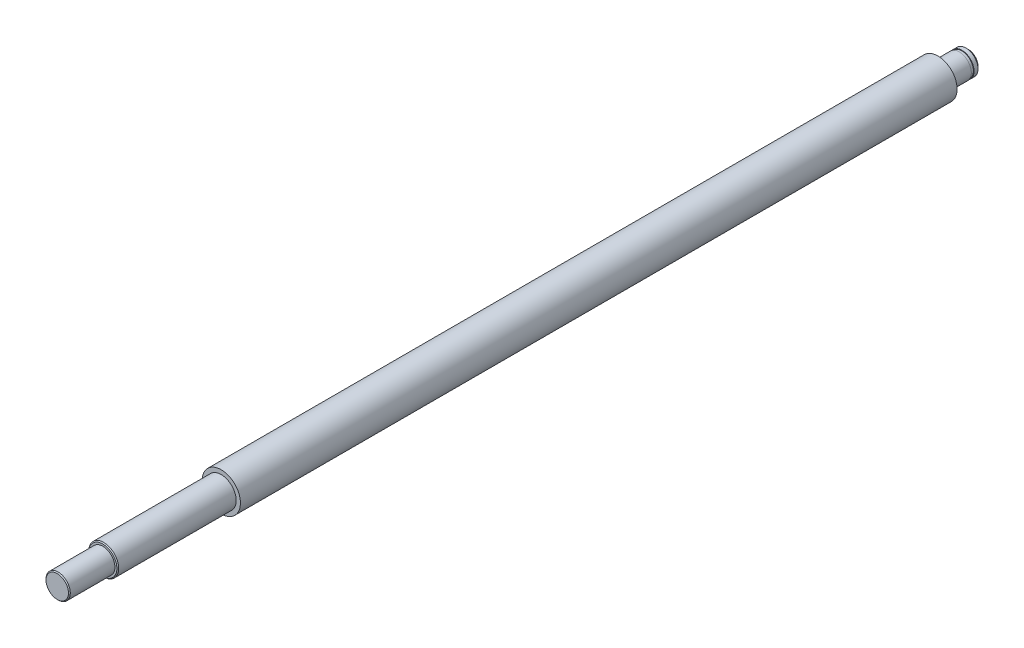
ISO-10303-21;
HEADER;
FILE_DESCRIPTION(('STEP AP214'),'2;1');
FILE_NAME('part.step','',(''),(''),'','','');
FILE_SCHEMA(('AUTOMOTIVE_DESIGN { 1 0 10303 214 1 1 1 1 }'));
ENDSEC;
DATA;
#1=APPLICATION_CONTEXT('core data for automotive mechanical design processes');
#2=APPLICATION_PROTOCOL_DEFINITION('international standard','automotive_design',2000,#1);
#3=PRODUCT_CONTEXT('',#1,'mechanical');
#4=PRODUCT('Part','Part','',(#3));
#5=PRODUCT_RELATED_PRODUCT_CATEGORY('part','',(#4));
#6=PRODUCT_DEFINITION_FORMATION('','',#4);
#7=PRODUCT_DEFINITION_CONTEXT('part definition',#1,'design');
#8=PRODUCT_DEFINITION('design','',#6,#7);
#9=PRODUCT_DEFINITION_SHAPE('','',#8);
#10=(LENGTH_UNIT() NAMED_UNIT(*) SI_UNIT(.MILLI.,.METRE.));
#11=(NAMED_UNIT(*) PLANE_ANGLE_UNIT() SI_UNIT($,.RADIAN.));
#12=(NAMED_UNIT(*) SI_UNIT($,.STERADIAN.) SOLID_ANGLE_UNIT());
#13=UNCERTAINTY_MEASURE_WITH_UNIT(LENGTH_MEASURE(1.E-05),#10,'distance_accuracy_value','');
#14=(GEOMETRIC_REPRESENTATION_CONTEXT(3) GLOBAL_UNCERTAINTY_ASSIGNED_CONTEXT((#13)) GLOBAL_UNIT_ASSIGNED_CONTEXT((#10,
#11,#12)) REPRESENTATION_CONTEXT('',''));
#15=CARTESIAN_POINT('',(0.,0.,0.));
#16=DIRECTION('',(0.,0.,1.));
#17=DIRECTION('',(1.,0.,0.));
#18=AXIS2_PLACEMENT_3D('',#15,#16,#17);
#19=CARTESIAN_POINT('',(0.,0.,150.));
#20=DIRECTION('',(0.,0.,-1.));
#21=DIRECTION('',(-1.,0.,0.));
#22=AXIS2_PLACEMENT_3D('',#19,#20,#21);
#23=PLANE('',#22);
#24=CARTESIAN_POINT('',(0.,0.,150.));
#25=DIRECTION('',(0.,0.,-1.));
#26=DIRECTION('',(-1.,0.,0.));
#27=AXIS2_PLACEMENT_3D('',#24,#25,#26);
#28=CIRCLE('',#27,3.69999999999998);
#29=CARTESIAN_POINT('',(-3.69999999999998,0.,150.));
#30=VERTEX_POINT('',#29);
#31=EDGE_CURVE('E48',#30,#30,#28,.F.);
#32=ORIENTED_EDGE('',*,*,#31,.T.);
#33=EDGE_LOOP('',(#32));
#34=FACE_BOUND('',#33,.T.);
#35=ADVANCED_FACE('F33',(#34),#23,.F.);
#36=CARTESIAN_POINT('',(0.,0.,150.));
#37=DIRECTION('',(0.,0.,1.));
#38=DIRECTION('',(1.,0.,0.));
#39=AXIS2_PLACEMENT_3D('',#36,#37,#38);
#40=CYLINDRICAL_SURFACE('',#39,4.);
#41=CARTESIAN_POINT('',(0.,0.,149.7));
#42=DIRECTION('',(0.,0.,-1.));
#43=DIRECTION('',(-1.,0.,0.));
#44=AXIS2_PLACEMENT_3D('',#41,#42,#43);
#45=CIRCLE('',#44,4.);
#46=CARTESIAN_POINT('',(-4.,0.,149.7));
#47=VERTEX_POINT('',#46);
#48=EDGE_CURVE('E44',#47,#47,#45,.T.);
#49=ORIENTED_EDGE('',*,*,#48,.T.);
#50=EDGE_LOOP('',(#49));
#51=FACE_BOUND('',#50,.T.);
#52=CARTESIAN_POINT('',(0.,0.,135.));
#53=DIRECTION('',(0.,0.,1.));
#54=DIRECTION('',(1.,0.,0.));
#55=AXIS2_PLACEMENT_3D('',#52,#53,#54);
#56=CIRCLE('',#55,4.);
#57=CARTESIAN_POINT('',(4.,0.,135.));
#58=VERTEX_POINT('',#57);
#59=EDGE_CURVE('E59',#58,#58,#56,.T.);
#60=ORIENTED_EDGE('',*,*,#59,.T.);
#61=EDGE_LOOP('',(#60));
#62=FACE_BOUND('',#61,.T.);
#63=ADVANCED_FACE('F127',(#51,#62),#40,.T.);
#64=CARTESIAN_POINT('',(0.,4.,135.));
#65=DIRECTION('',(0.,0.,-1.));
#66=DIRECTION('',(-1.,0.,0.));
#67=AXIS2_PLACEMENT_3D('',#64,#65,#66);
#68=PLANE('',#67);
#69=CARTESIAN_POINT('',(0.,0.,135.));
#70=DIRECTION('',(0.,0.,-1.));
#71=DIRECTION('',(-1.,0.,0.));
#72=AXIS2_PLACEMENT_3D('',#69,#70,#71);
#73=CIRCLE('',#72,4.64000000000001);
#74=CARTESIAN_POINT('',(-4.64000000000001,0.,135.));
#75=VERTEX_POINT('',#74);
#76=EDGE_CURVE('E40',#75,#75,#73,.F.);
#77=ORIENTED_EDGE('',*,*,#76,.T.);
#78=EDGE_LOOP('',(#77));
#79=FACE_BOUND('',#78,.T.);
#80=ORIENTED_EDGE('',*,*,#59,.F.);
#81=EDGE_LOOP('',(#80));
#82=FACE_BOUND('',#81,.T.);
#83=ADVANCED_FACE('F133',(#79,#82),#68,.F.);
#84=CARTESIAN_POINT('',(0.,0.,150.));
#85=DIRECTION('',(0.,0.,1.));
#86=DIRECTION('',(1.,0.,0.));
#87=AXIS2_PLACEMENT_3D('',#84,#85,#86);
#88=CYLINDRICAL_SURFACE('',#87,4.94);
#89=CARTESIAN_POINT('',(0.,0.,134.7));
#90=DIRECTION('',(0.,0.,-1.));
#91=DIRECTION('',(-1.,0.,0.));
#92=AXIS2_PLACEMENT_3D('',#89,#90,#91);
#93=CIRCLE('',#92,4.94);
#94=CARTESIAN_POINT('',(-4.94,0.,134.7));
#95=VERTEX_POINT('',#94);
#96=EDGE_CURVE('E10',#95,#95,#93,.T.);
#97=ORIENTED_EDGE('',*,*,#96,.T.);
#98=EDGE_LOOP('',(#97));
#99=FACE_BOUND('',#98,.T.);
#100=CARTESIAN_POINT('',(0.,0.,96.));
#101=DIRECTION('',(0.,0.,1.));
#102=DIRECTION('',(1.,0.,0.));
#103=AXIS2_PLACEMENT_3D('',#100,#101,#102);
#104=CIRCLE('',#103,4.94);
#105=CARTESIAN_POINT('',(4.94,0.,96.));
#106=VERTEX_POINT('',#105);
#107=EDGE_CURVE('E62',#106,#106,#104,.T.);
#108=ORIENTED_EDGE('',*,*,#107,.T.);
#109=EDGE_LOOP('',(#108));
#110=FACE_BOUND('',#109,.T.);
#111=ADVANCED_FACE('F155',(#99,#110),#88,.T.);
#112=CARTESIAN_POINT('',(0.,4.94,96.));
#113=DIRECTION('',(0.,0.,-1.));
#114=DIRECTION('',(-1.,0.,0.));
#115=AXIS2_PLACEMENT_3D('',#112,#113,#114);
#116=PLANE('',#115);
#117=ORIENTED_EDGE('',*,*,#107,.F.);
#118=EDGE_LOOP('',(#117));
#119=FACE_BOUND('',#118,.T.);
#120=CARTESIAN_POINT('',(0.,0.,96.));
#121=DIRECTION('',(0.,0.,1.));
#122=DIRECTION('',(1.,0.,0.));
#123=AXIS2_PLACEMENT_3D('',#120,#121,#122);
#124=CIRCLE('',#123,6.32);
#125=CARTESIAN_POINT('',(6.32,0.,96.));
#126=VERTEX_POINT('',#125);
#127=EDGE_CURVE('E65',#126,#126,#124,.T.);
#128=ORIENTED_EDGE('',*,*,#127,.T.);
#129=EDGE_LOOP('',(#128));
#130=FACE_BOUND('',#129,.T.);
#131=ADVANCED_FACE('F122',(#119,#130),#116,.F.);
#132=CARTESIAN_POINT('',(0.,0.,150.));
#133=DIRECTION('',(0.,0.,1.));
#134=DIRECTION('',(1.,0.,0.));
#135=AXIS2_PLACEMENT_3D('',#132,#133,#134);
#136=CYLINDRICAL_SURFACE('',#135,6.32);
#137=ORIENTED_EDGE('',*,*,#127,.F.);
#138=EDGE_LOOP('',(#137));
#139=FACE_BOUND('',#138,.T.);
#140=CARTESIAN_POINT('',(0.,0.,-140.));
#141=DIRECTION('',(0.,0.,1.));
#142=DIRECTION('',(1.,0.,0.));
#143=AXIS2_PLACEMENT_3D('',#140,#141,#142);
#144=CIRCLE('',#143,6.32);
#145=CARTESIAN_POINT('',(6.32,0.,-140.));
#146=VERTEX_POINT('',#145);
#147=EDGE_CURVE('E68',#146,#146,#144,.T.);
#148=ORIENTED_EDGE('',*,*,#147,.T.);
#149=EDGE_LOOP('',(#148));
#150=FACE_BOUND('',#149,.T.);
#151=ADVANCED_FACE('F116',(#139,#150),#136,.T.);
#152=CARTESIAN_POINT('',(0.,6.32,-140.));
#153=DIRECTION('',(0.,0.,1.));
#154=DIRECTION('',(1.,0.,0.));
#155=AXIS2_PLACEMENT_3D('',#152,#153,#154);
#156=PLANE('',#155);
#157=ORIENTED_EDGE('',*,*,#147,.F.);
#158=EDGE_LOOP('',(#157));
#159=FACE_BOUND('',#158,.T.);
#160=CARTESIAN_POINT('',(0.,0.,-140.));
#161=DIRECTION('',(0.,0.,1.));
#162=DIRECTION('',(1.,0.,0.));
#163=AXIS2_PLACEMENT_3D('',#160,#161,#162);
#164=CIRCLE('',#163,4.);
#165=CARTESIAN_POINT('',(4.,0.,-140.));
#166=VERTEX_POINT('',#165);
#167=EDGE_CURVE('E71',#166,#166,#164,.T.);
#168=ORIENTED_EDGE('',*,*,#167,.T.);
#169=EDGE_LOOP('',(#168));
#170=FACE_BOUND('',#169,.T.);
#171=ADVANCED_FACE('F111',(#159,#170),#156,.F.);
#172=CARTESIAN_POINT('',(0.,0.,150.));
#173=DIRECTION('',(0.,0.,1.));
#174=DIRECTION('',(1.,0.,0.));
#175=AXIS2_PLACEMENT_3D('',#172,#173,#174);
#176=CYLINDRICAL_SURFACE('',#175,4.);
#177=CARTESIAN_POINT('',(0.,0.,-147.));
#178=DIRECTION('',(0.,0.,-1.));
#179=DIRECTION('',(0.,1.,0.));
#180=AXIS2_PLACEMENT_3D('',#177,#178,#179);
#181=CIRCLE('',#180,4.00000000000002);
#182=CARTESIAN_POINT('',(0.,4.,-147.));
#183=VERTEX_POINT('',#182);
#184=EDGE_CURVE('E80',#183,#183,#181,.T.);
#185=ORIENTED_EDGE('',*,*,#184,.F.);
#186=EDGE_LOOP('',(#185));
#187=FACE_BOUND('',#186,.T.);
#188=ORIENTED_EDGE('',*,*,#167,.F.);
#189=EDGE_LOOP('',(#188));
#190=FACE_BOUND('',#189,.T.);
#191=ADVANCED_FACE('F93',(#187,#190),#176,.T.);
#192=CARTESIAN_POINT('',(0.,4.,-147.9));
#193=DIRECTION('',(0.,0.,-1.));
#194=DIRECTION('',(0.,1.,0.));
#195=AXIS2_PLACEMENT_3D('',#192,#193,#194);
#196=PLANE('',#195);
#197=CARTESIAN_POINT('',(0.,0.,-147.9));
#198=DIRECTION('',(0.,0.,-1.));
#199=DIRECTION('',(0.,1.,0.));
#200=AXIS2_PLACEMENT_3D('',#197,#198,#199);
#201=CIRCLE('',#200,4.00000000000001);
#202=CARTESIAN_POINT('',(0.,4.,-147.9));
#203=VERTEX_POINT('',#202);
#204=EDGE_CURVE('E83',#203,#203,#201,.T.);
#205=ORIENTED_EDGE('',*,*,#204,.F.);
#206=EDGE_LOOP('',(#205));
#207=FACE_BOUND('',#206,.T.);
#208=CARTESIAN_POINT('',(0.,0.,-147.9));
#209=DIRECTION('',(0.,0.,-1.));
#210=DIRECTION('',(0.,1.,0.));
#211=AXIS2_PLACEMENT_3D('',#208,#209,#210);
#212=CIRCLE('',#211,3.79999999999996);
#213=CARTESIAN_POINT('',(0.,3.79999999999994,-147.9));
#214=VERTEX_POINT('',#213);
#215=EDGE_CURVE('E74',#214,#214,#212,.T.);
#216=ORIENTED_EDGE('',*,*,#215,.T.);
#217=EDGE_LOOP('',(#216));
#218=FACE_BOUND('',#217,.T.);
#219=ADVANCED_FACE('F89',(#207,#218),#196,.F.);
#220=CARTESIAN_POINT('',(0.,0.,-150.));
#221=DIRECTION('',(0.,0.,-1.));
#222=DIRECTION('',(0.,1.,0.));
#223=AXIS2_PLACEMENT_3D('',#220,#221,#222);
#224=CYLINDRICAL_SURFACE('',#223,3.79999999999996);
#225=ORIENTED_EDGE('',*,*,#215,.F.);
#226=EDGE_LOOP('',(#225));
#227=FACE_BOUND('',#226,.T.);
#228=CARTESIAN_POINT('',(0.,0.,-147.));
#229=DIRECTION('',(0.,0.,-1.));
#230=DIRECTION('',(0.,1.,0.));
#231=AXIS2_PLACEMENT_3D('',#228,#229,#230);
#232=CIRCLE('',#231,3.79999999999996);
#233=CARTESIAN_POINT('',(0.,3.79999999999994,-147.));
#234=VERTEX_POINT('',#233);
#235=EDGE_CURVE('E77',#234,#234,#232,.T.);
#236=ORIENTED_EDGE('',*,*,#235,.T.);
#237=EDGE_LOOP('',(#236));
#238=FACE_BOUND('',#237,.T.);
#239=ADVANCED_FACE('F92',(#227,#238),#224,.T.);
#240=CARTESIAN_POINT('',(0.,4.,-147.));
#241=DIRECTION('',(0.,0.,1.));
#242=DIRECTION('',(0.,-1.,0.));
#243=AXIS2_PLACEMENT_3D('',#240,#241,#242);
#244=PLANE('',#243);
#245=ORIENTED_EDGE('',*,*,#235,.F.);
#246=EDGE_LOOP('',(#245));
#247=FACE_BOUND('',#246,.T.);
#248=ORIENTED_EDGE('',*,*,#184,.T.);
#249=EDGE_LOOP('',(#248));
#250=FACE_BOUND('',#249,.T.);
#251=ADVANCED_FACE('F99',(#247,#250),#244,.F.);
#252=CARTESIAN_POINT('',(0.,4.,-150.));
#253=DIRECTION('',(0.,0.,1.));
#254=DIRECTION('',(1.,0.,0.));
#255=AXIS2_PLACEMENT_3D('',#252,#253,#254);
#256=PLANE('',#255);
#257=CARTESIAN_POINT('',(0.,0.,-150.));
#258=DIRECTION('',(0.,0.,1.));
#259=DIRECTION('',(1.,0.,0.));
#260=AXIS2_PLACEMENT_3D('',#257,#258,#259);
#261=CIRCLE('',#260,3.19999999999998);
#262=CARTESIAN_POINT('',(3.19999999999998,0.,-150.));
#263=VERTEX_POINT('',#262);
#264=EDGE_CURVE('E53',#263,#263,#261,.F.);
#265=ORIENTED_EDGE('',*,*,#264,.T.);
#266=EDGE_LOOP('',(#265));
#267=FACE_BOUND('',#266,.T.);
#268=ADVANCED_FACE('F105',(#267),#256,.F.);
#269=CARTESIAN_POINT('',(0.,0.,-149.2));
#270=DIRECTION('',(0.,0.,1.));
#271=DIRECTION('',(1.,0.,0.));
#272=AXIS2_PLACEMENT_3D('',#269,#270,#271);
#273=CIRCLE('',#272,4.);
#274=CARTESIAN_POINT('',(4.,0.,-149.2));
#275=VERTEX_POINT('',#274);
#276=EDGE_CURVE('E56',#275,#275,#273,.T.);
#277=ORIENTED_EDGE('',*,*,#276,.T.);
#278=EDGE_LOOP('',(#277));
#279=FACE_BOUND('',#278,.T.);
#280=ORIENTED_EDGE('',*,*,#204,.T.);
#281=EDGE_LOOP('',(#280));
#282=FACE_BOUND('',#281,.T.);
#283=ADVANCED_FACE('F87',(#279,#282),#176,.T.);
#284=CARTESIAN_POINT('',(0.,0.,-149.2));
#285=DIRECTION('',(0.,0.,1.));
#286=DIRECTION('',(1.,0.,0.));
#287=AXIS2_PLACEMENT_3D('',#284,#285,#286);
#288=CONICAL_SURFACE('',#287,4.,0.785398163397446);
#289=ORIENTED_EDGE('',*,*,#264,.F.);
#290=EDGE_LOOP('',(#289));
#291=FACE_BOUND('',#290,.T.);
#292=ORIENTED_EDGE('',*,*,#276,.F.);
#293=EDGE_LOOP('',(#292));
#294=FACE_BOUND('',#293,.T.);
#295=ADVANCED_FACE('F138',(#291,#294),#288,.T.);
#296=CARTESIAN_POINT('',(0.,0.,150.));
#297=DIRECTION('',(0.,0.,-1.));
#298=DIRECTION('',(-1.,0.,0.));
#299=AXIS2_PLACEMENT_3D('',#296,#297,#298);
#300=CONICAL_SURFACE('',#299,3.69999999999998,0.785398163397443);
#301=ORIENTED_EDGE('',*,*,#48,.F.);
#302=EDGE_LOOP('',(#301));
#303=FACE_BOUND('',#302,.T.);
#304=ORIENTED_EDGE('',*,*,#31,.F.);
#305=EDGE_LOOP('',(#304));
#306=FACE_BOUND('',#305,.T.);
#307=ADVANCED_FACE('F140',(#303,#306),#300,.T.);
#308=CARTESIAN_POINT('',(0.,0.,135.));
#309=DIRECTION('',(0.,0.,-1.));
#310=DIRECTION('',(-1.,0.,0.));
#311=AXIS2_PLACEMENT_3D('',#308,#309,#310);
#312=CONICAL_SURFACE('',#311,4.64000000000001,0.78539816339745);
#313=ORIENTED_EDGE('',*,*,#96,.F.);
#314=EDGE_LOOP('',(#313));
#315=FACE_BOUND('',#314,.T.);
#316=ORIENTED_EDGE('',*,*,#76,.F.);
#317=EDGE_LOOP('',(#316));
#318=FACE_BOUND('',#317,.T.);
#319=ADVANCED_FACE('F35',(#315,#318),#312,.T.);
#320=CLOSED_SHELL('',(#35,#63,#83,#111,#131,#151,#171,#191,#219,#239,#251,#268,#283,#295,#307,#319));
#321=MANIFOLD_SOLID_BREP('B2',#320);
#322=ADVANCED_BREP_SHAPE_REPRESENTATION('',(#18,#321),#14);
#323=SHAPE_DEFINITION_REPRESENTATION(#9,#322);
ENDSEC;
END-ISO-10303-21;
